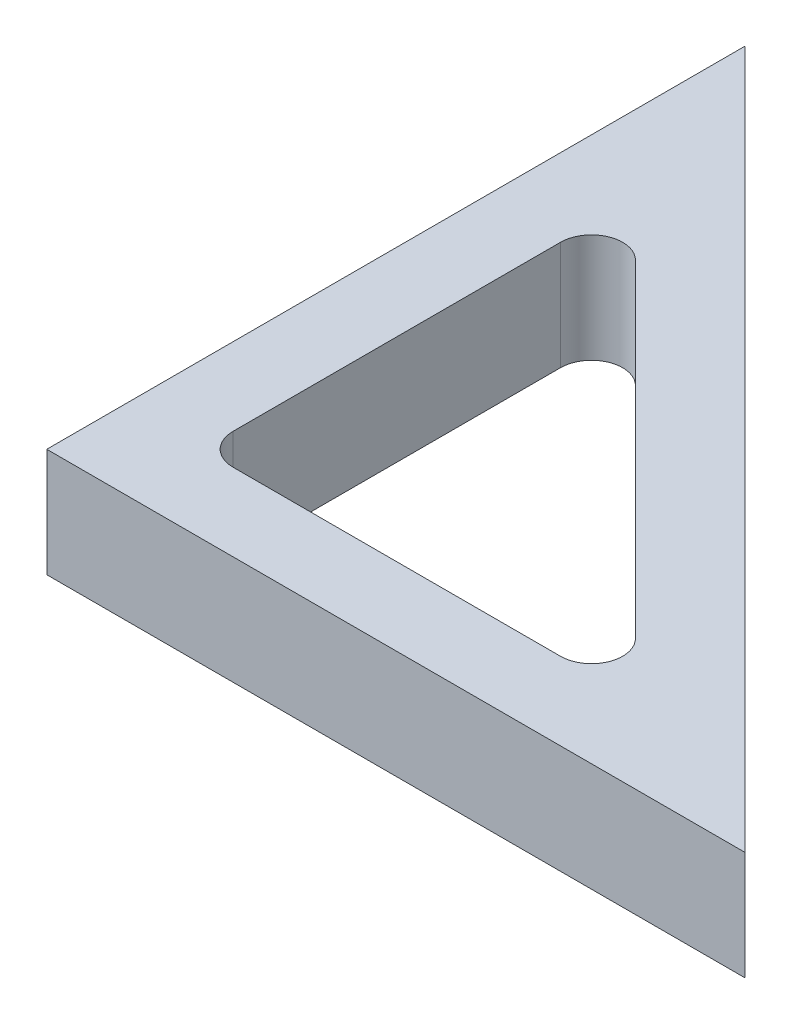
ISO-10303-21;
HEADER;
FILE_DESCRIPTION(('STEP AP214'),'2;1');
FILE_NAME('part.step','',(''),(''),'','','');
FILE_SCHEMA(('AUTOMOTIVE_DESIGN { 1 0 10303 214 1 1 1 1 }'));
ENDSEC;
DATA;
#1=APPLICATION_CONTEXT('core data for automotive mechanical design processes');
#2=APPLICATION_PROTOCOL_DEFINITION('international standard','automotive_design',2000,#1);
#3=PRODUCT_CONTEXT('',#1,'mechanical');
#4=PRODUCT('Part','Part','',(#3));
#5=PRODUCT_RELATED_PRODUCT_CATEGORY('part','',(#4));
#6=PRODUCT_DEFINITION_FORMATION('','',#4);
#7=PRODUCT_DEFINITION_CONTEXT('part definition',#1,'design');
#8=PRODUCT_DEFINITION('design','',#6,#7);
#9=PRODUCT_DEFINITION_SHAPE('','',#8);
#10=(LENGTH_UNIT() NAMED_UNIT(*) SI_UNIT(.MILLI.,.METRE.));
#11=(NAMED_UNIT(*) PLANE_ANGLE_UNIT() SI_UNIT($,.RADIAN.));
#12=(NAMED_UNIT(*) SI_UNIT($,.STERADIAN.) SOLID_ANGLE_UNIT());
#13=UNCERTAINTY_MEASURE_WITH_UNIT(LENGTH_MEASURE(1.E-05),#10,'distance_accuracy_value','');
#14=(GEOMETRIC_REPRESENTATION_CONTEXT(3) GLOBAL_UNCERTAINTY_ASSIGNED_CONTEXT((#13)) GLOBAL_UNIT_ASSIGNED_CONTEXT((#10,
#11,#12)) REPRESENTATION_CONTEXT('',''));
#15=CARTESIAN_POINT('',(0.,0.,0.));
#16=DIRECTION('',(0.,0.,1.));
#17=DIRECTION('',(1.,0.,0.));
#18=AXIS2_PLACEMENT_3D('',#15,#16,#17);
#19=CARTESIAN_POINT('',(0.,7.,0.));
#20=DIRECTION('',(0.,1.,0.));
#21=DIRECTION('',(0.,0.,1.));
#22=AXIS2_PLACEMENT_3D('',#19,#20,#21);
#23=PLANE('',#22);
#24=DIRECTION('',(1.,0.,0.));
#25=VECTOR('',#24,1.);
#26=CARTESIAN_POINT('',(0.,7.,0.));
#27=LINE('',#26,#25);
#28=CARTESIAN_POINT('',(0.,7.,0.));
#29=VERTEX_POINT('',#28);
#30=CARTESIAN_POINT('',(45.,7.,0.));
#31=VERTEX_POINT('',#30);
#32=EDGE_CURVE('E161',#29,#31,#27,.T.);
#33=ORIENTED_EDGE('',*,*,#32,.T.);
#34=DIRECTION('',(-0.707106781186548,0.,-0.707106781186548));
#35=VECTOR('',#34,1.);
#36=CARTESIAN_POINT('',(0.,7.,-45.));
#37=LINE('',#36,#35);
#38=CARTESIAN_POINT('',(0.,7.,-45.));
#39=VERTEX_POINT('',#38);
#40=EDGE_CURVE('E163',#31,#39,#37,.T.);
#41=ORIENTED_EDGE('',*,*,#40,.T.);
#42=DIRECTION('',(0.,0.,1.));
#43=VECTOR('',#42,1.);
#44=CARTESIAN_POINT('',(0.,7.,0.));
#45=LINE('',#44,#43);
#46=EDGE_CURVE('E167',#39,#29,#45,.T.);
#47=ORIENTED_EDGE('',*,*,#46,.T.);
#48=EDGE_LOOP('',(#33,#41,#47));
#49=FACE_BOUND('',#48,.T.);
#50=DIRECTION('',(-0.707106781186548,0.,-0.707106781186547));
#51=VECTOR('',#50,1.);
#52=CARTESIAN_POINT('',(8.41421356237313,7.,-29.5147186257614));
#53=LINE('',#52,#51);
#54=CARTESIAN_POINT('',(29.5147186257614,7.,-8.41421356237313));
#55=VERTEX_POINT('',#54);
#56=CARTESIAN_POINT('',(8.41421356237313,7.,-29.5147186257614));
#57=VERTEX_POINT('',#56);
#58=EDGE_CURVE('E119',#55,#57,#53,.T.);
#59=ORIENTED_EDGE('',*,*,#58,.F.);
#60=CARTESIAN_POINT('',(28.1005050633883,7.,-7.));
#61=DIRECTION('',(0.,1.,0.));
#62=DIRECTION('',(0.,0.,-1.));
#63=AXIS2_PLACEMENT_3D('',#60,#61,#62);
#64=CIRCLE('',#63,2.);
#65=CARTESIAN_POINT('',(28.1005050633883,7.,-5.));
#66=VERTEX_POINT('',#65);
#67=EDGE_CURVE('E110',#66,#55,#64,.T.);
#68=ORIENTED_EDGE('',*,*,#67,.F.);
#69=DIRECTION('',(1.,0.,0.));
#70=VECTOR('',#69,1.);
#71=CARTESIAN_POINT('',(7.00000000000002,7.,-5.));
#72=LINE('',#71,#70);
#73=CARTESIAN_POINT('',(7.,7.,-5.));
#74=VERTEX_POINT('',#73);
#75=EDGE_CURVE('E137',#74,#66,#72,.T.);
#76=ORIENTED_EDGE('',*,*,#75,.F.);
#77=CARTESIAN_POINT('',(7.,7.,-7.));
#78=DIRECTION('',(0.,1.,0.));
#79=DIRECTION('',(0.,0.,1.));
#80=AXIS2_PLACEMENT_3D('',#77,#78,#79);
#81=CIRCLE('',#80,2.);
#82=CARTESIAN_POINT('',(5.,7.,-7.00000000000002));
#83=VERTEX_POINT('',#82);
#84=EDGE_CURVE('E140',#83,#74,#81,.T.);
#85=ORIENTED_EDGE('',*,*,#84,.F.);
#86=DIRECTION('',(0.,0.,1.));
#87=VECTOR('',#86,1.);
#88=CARTESIAN_POINT('',(5.,7.,-7.00000000000002));
#89=LINE('',#88,#87);
#90=CARTESIAN_POINT('',(5.,7.,-28.1005050633883));
#91=VERTEX_POINT('',#90);
#92=EDGE_CURVE('E133',#91,#83,#89,.T.);
#93=ORIENTED_EDGE('',*,*,#92,.F.);
#94=CARTESIAN_POINT('',(7.,7.,-28.1005050633883));
#95=DIRECTION('',(0.,1.,0.));
#96=DIRECTION('',(0.,0.,1.));
#97=AXIS2_PLACEMENT_3D('',#94,#95,#96);
#98=CIRCLE('',#97,2.);
#99=EDGE_CURVE('E131',#57,#91,#98,.T.);
#100=ORIENTED_EDGE('',*,*,#99,.F.);
#101=EDGE_LOOP('',(#59,#68,#76,#85,#93,#100));
#102=FACE_BOUND('',#101,.T.);
#103=ADVANCED_FACE('F39',(#49,#102),#23,.T.);
#104=CARTESIAN_POINT('',(0.,0.,0.));
#105=DIRECTION('',(0.,1.,0.));
#106=DIRECTION('',(0.,0.,1.));
#107=AXIS2_PLACEMENT_3D('',#104,#105,#106);
#108=PLANE('',#107);
#109=DIRECTION('',(1.,0.,0.));
#110=VECTOR('',#109,1.);
#111=CARTESIAN_POINT('',(0.,0.,0.));
#112=LINE('',#111,#110);
#113=CARTESIAN_POINT('',(0.,0.,0.));
#114=VERTEX_POINT('',#113);
#115=CARTESIAN_POINT('',(45.,0.,0.));
#116=VERTEX_POINT('',#115);
#117=EDGE_CURVE('E128',#114,#116,#112,.T.);
#118=ORIENTED_EDGE('',*,*,#117,.F.);
#119=DIRECTION('',(0.,0.,1.));
#120=VECTOR('',#119,1.);
#121=CARTESIAN_POINT('',(0.,0.,0.));
#122=LINE('',#121,#120);
#123=CARTESIAN_POINT('',(0.,0.,-45.));
#124=VERTEX_POINT('',#123);
#125=EDGE_CURVE('E165',#124,#114,#122,.T.);
#126=ORIENTED_EDGE('',*,*,#125,.F.);
#127=DIRECTION('',(-0.707106781186548,0.,-0.707106781186548));
#128=VECTOR('',#127,1.);
#129=CARTESIAN_POINT('',(0.,0.,-45.));
#130=LINE('',#129,#128);
#131=EDGE_CURVE('E175',#116,#124,#130,.T.);
#132=ORIENTED_EDGE('',*,*,#131,.F.);
#133=EDGE_LOOP('',(#118,#126,#132));
#134=FACE_BOUND('',#133,.T.);
#135=CARTESIAN_POINT('',(28.1005050633883,0.,-7.));
#136=DIRECTION('',(0.,1.,0.));
#137=DIRECTION('',(0.,0.,-1.));
#138=AXIS2_PLACEMENT_3D('',#135,#136,#137);
#139=CIRCLE('',#138,2.);
#140=CARTESIAN_POINT('',(28.1005050633883,0.,-5.));
#141=VERTEX_POINT('',#140);
#142=CARTESIAN_POINT('',(29.5147186257614,0.,-8.41421356237313));
#143=VERTEX_POINT('',#142);
#144=EDGE_CURVE('E62',#141,#143,#139,.T.);
#145=ORIENTED_EDGE('',*,*,#144,.T.);
#146=DIRECTION('',(-0.707106781186548,0.,-0.707106781186547));
#147=VECTOR('',#146,1.);
#148=CARTESIAN_POINT('',(8.41421356237313,0.,-29.5147186257614));
#149=LINE('',#148,#147);
#150=CARTESIAN_POINT('',(8.41421356237313,0.,-29.5147186257614));
#151=VERTEX_POINT('',#150);
#152=EDGE_CURVE('E124',#143,#151,#149,.T.);
#153=ORIENTED_EDGE('',*,*,#152,.T.);
#154=CARTESIAN_POINT('',(7.,0.,-28.1005050633883));
#155=DIRECTION('',(0.,1.,0.));
#156=DIRECTION('',(0.,0.,1.));
#157=AXIS2_PLACEMENT_3D('',#154,#155,#156);
#158=CIRCLE('',#157,2.);
#159=CARTESIAN_POINT('',(5.,0.,-28.1005050633883));
#160=VERTEX_POINT('',#159);
#161=EDGE_CURVE('E142',#151,#160,#158,.T.);
#162=ORIENTED_EDGE('',*,*,#161,.T.);
#163=DIRECTION('',(0.,0.,1.));
#164=VECTOR('',#163,1.);
#165=CARTESIAN_POINT('',(5.,0.,-7.00000000000002));
#166=LINE('',#165,#164);
#167=CARTESIAN_POINT('',(5.,0.,-7.00000000000002));
#168=VERTEX_POINT('',#167);
#169=EDGE_CURVE('E147',#160,#168,#166,.T.);
#170=ORIENTED_EDGE('',*,*,#169,.T.);
#171=CARTESIAN_POINT('',(7.,0.,-7.));
#172=DIRECTION('',(0.,1.,0.));
#173=DIRECTION('',(0.,0.,1.));
#174=AXIS2_PLACEMENT_3D('',#171,#172,#173);
#175=CIRCLE('',#174,2.);
#176=CARTESIAN_POINT('',(7.,0.,-5.));
#177=VERTEX_POINT('',#176);
#178=EDGE_CURVE('E146',#168,#177,#175,.T.);
#179=ORIENTED_EDGE('',*,*,#178,.T.);
#180=DIRECTION('',(1.,0.,0.));
#181=VECTOR('',#180,1.);
#182=CARTESIAN_POINT('',(7.00000000000002,0.,-5.));
#183=LINE('',#182,#181);
#184=EDGE_CURVE('E118',#177,#141,#183,.T.);
#185=ORIENTED_EDGE('',*,*,#184,.T.);
#186=EDGE_LOOP('',(#145,#153,#162,#170,#179,#185));
#187=FACE_BOUND('',#186,.T.);
#188=ADVANCED_FACE('F186',(#134,#187),#108,.F.);
#189=CARTESIAN_POINT('',(0.,7.,0.));
#190=DIRECTION('',(0.,0.,-1.));
#191=DIRECTION('',(-1.,0.,0.));
#192=AXIS2_PLACEMENT_3D('',#189,#190,#191);
#193=PLANE('',#192);
#194=ORIENTED_EDGE('',*,*,#117,.T.);
#195=DIRECTION('',(0.,-1.,0.));
#196=VECTOR('',#195,1.);
#197=CARTESIAN_POINT('',(45.,7.,0.));
#198=LINE('',#197,#196);
#199=EDGE_CURVE('E11',#31,#116,#198,.T.);
#200=ORIENTED_EDGE('',*,*,#199,.F.);
#201=ORIENTED_EDGE('',*,*,#32,.F.);
#202=DIRECTION('',(0.,-1.,0.));
#203=VECTOR('',#202,1.);
#204=CARTESIAN_POINT('',(0.,7.,0.));
#205=LINE('',#204,#203);
#206=EDGE_CURVE('E170',#29,#114,#205,.T.);
#207=ORIENTED_EDGE('',*,*,#206,.T.);
#208=EDGE_LOOP('',(#194,#200,#201,#207));
#209=FACE_BOUND('',#208,.T.);
#210=ADVANCED_FACE('F41',(#209),#193,.F.);
#211=CARTESIAN_POINT('',(0.,7.,-45.));
#212=DIRECTION('',(-0.707106781186547,0.,0.707106781186547));
#213=DIRECTION('',(0.707106781186548,0.,0.707106781186548));
#214=AXIS2_PLACEMENT_3D('',#211,#212,#213);
#215=PLANE('',#214);
#216=ORIENTED_EDGE('',*,*,#131,.T.);
#217=DIRECTION('',(0.,-1.,0.));
#218=VECTOR('',#217,1.);
#219=CARTESIAN_POINT('',(0.,7.,-45.));
#220=LINE('',#219,#218);
#221=EDGE_CURVE('E50',#39,#124,#220,.T.);
#222=ORIENTED_EDGE('',*,*,#221,.F.);
#223=ORIENTED_EDGE('',*,*,#40,.F.);
#224=ORIENTED_EDGE('',*,*,#199,.T.);
#225=EDGE_LOOP('',(#216,#222,#223,#224));
#226=FACE_BOUND('',#225,.T.);
#227=ADVANCED_FACE('F195',(#226),#215,.F.);
#228=CARTESIAN_POINT('',(0.,7.,0.));
#229=DIRECTION('',(1.,0.,0.));
#230=DIRECTION('',(0.,0.,-1.));
#231=AXIS2_PLACEMENT_3D('',#228,#229,#230);
#232=PLANE('',#231);
#233=ORIENTED_EDGE('',*,*,#125,.T.);
#234=ORIENTED_EDGE('',*,*,#206,.F.);
#235=ORIENTED_EDGE('',*,*,#46,.F.);
#236=ORIENTED_EDGE('',*,*,#221,.T.);
#237=EDGE_LOOP('',(#233,#234,#235,#236));
#238=FACE_BOUND('',#237,.T.);
#239=ADVANCED_FACE('F181',(#238),#232,.F.);
#240=CARTESIAN_POINT('',(28.1005050633883,7.,-7.));
#241=DIRECTION('',(0.,-1.,0.));
#242=DIRECTION('',(0.,0.,-1.));
#243=AXIS2_PLACEMENT_3D('',#240,#241,#242);
#244=CYLINDRICAL_SURFACE('',#243,2.);
#245=ORIENTED_EDGE('',*,*,#144,.F.);
#246=DIRECTION('',(0.,-1.,0.));
#247=VECTOR('',#246,1.);
#248=CARTESIAN_POINT('',(28.1005050633883,7.,-5.));
#249=LINE('',#248,#247);
#250=EDGE_CURVE('E114',#66,#141,#249,.T.);
#251=ORIENTED_EDGE('',*,*,#250,.F.);
#252=ORIENTED_EDGE('',*,*,#67,.T.);
#253=DIRECTION('',(0.,-1.,0.));
#254=VECTOR('',#253,1.);
#255=CARTESIAN_POINT('',(29.5147186257614,7.,-8.41421356237313));
#256=LINE('',#255,#254);
#257=EDGE_CURVE('E111',#55,#143,#256,.T.);
#258=ORIENTED_EDGE('',*,*,#257,.T.);
#259=EDGE_LOOP('',(#245,#251,#252,#258));
#260=FACE_BOUND('',#259,.T.);
#261=ADVANCED_FACE('F115',(#260),#244,.F.);
#262=CARTESIAN_POINT('',(8.41421356237313,7.,-29.5147186257614));
#263=DIRECTION('',(-0.707106781186547,0.,0.707106781186548));
#264=DIRECTION('',(0.707106781186548,0.,0.707106781186547));
#265=AXIS2_PLACEMENT_3D('',#262,#263,#264);
#266=PLANE('',#265);
#267=ORIENTED_EDGE('',*,*,#152,.F.);
#268=ORIENTED_EDGE('',*,*,#257,.F.);
#269=ORIENTED_EDGE('',*,*,#58,.T.);
#270=DIRECTION('',(0.,-1.,0.));
#271=VECTOR('',#270,1.);
#272=CARTESIAN_POINT('',(8.41421356237313,7.,-29.5147186257614));
#273=LINE('',#272,#271);
#274=EDGE_CURVE('E130',#57,#151,#273,.T.);
#275=ORIENTED_EDGE('',*,*,#274,.T.);
#276=EDGE_LOOP('',(#267,#268,#269,#275));
#277=FACE_BOUND('',#276,.T.);
#278=ADVANCED_FACE('F122',(#277),#266,.T.);
#279=CARTESIAN_POINT('',(7.,7.,-28.1005050633883));
#280=DIRECTION('',(0.,-1.,0.));
#281=DIRECTION('',(0.,0.,-1.));
#282=AXIS2_PLACEMENT_3D('',#279,#280,#281);
#283=CYLINDRICAL_SURFACE('',#282,2.);
#284=ORIENTED_EDGE('',*,*,#161,.F.);
#285=ORIENTED_EDGE('',*,*,#274,.F.);
#286=ORIENTED_EDGE('',*,*,#99,.T.);
#287=DIRECTION('',(0.,-1.,0.));
#288=VECTOR('',#287,1.);
#289=CARTESIAN_POINT('',(5.,7.,-28.1005050633883));
#290=LINE('',#289,#288);
#291=EDGE_CURVE('E156',#91,#160,#290,.T.);
#292=ORIENTED_EDGE('',*,*,#291,.T.);
#293=EDGE_LOOP('',(#284,#285,#286,#292));
#294=FACE_BOUND('',#293,.T.);
#295=ADVANCED_FACE('F210',(#294),#283,.F.);
#296=CARTESIAN_POINT('',(5.,7.,-7.00000000000002));
#297=DIRECTION('',(1.,0.,0.));
#298=DIRECTION('',(0.,0.,-1.));
#299=AXIS2_PLACEMENT_3D('',#296,#297,#298);
#300=PLANE('',#299);
#301=ORIENTED_EDGE('',*,*,#169,.F.);
#302=ORIENTED_EDGE('',*,*,#291,.F.);
#303=ORIENTED_EDGE('',*,*,#92,.T.);
#304=DIRECTION('',(0.,-1.,0.));
#305=VECTOR('',#304,1.);
#306=CARTESIAN_POINT('',(5.,7.,-7.00000000000002));
#307=LINE('',#306,#305);
#308=EDGE_CURVE('E157',#83,#168,#307,.T.);
#309=ORIENTED_EDGE('',*,*,#308,.T.);
#310=EDGE_LOOP('',(#301,#302,#303,#309));
#311=FACE_BOUND('',#310,.T.);
#312=ADVANCED_FACE('F211',(#311),#300,.T.);
#313=CARTESIAN_POINT('',(7.,7.,-7.));
#314=DIRECTION('',(0.,-1.,0.));
#315=DIRECTION('',(0.,0.,-1.));
#316=AXIS2_PLACEMENT_3D('',#313,#314,#315);
#317=CYLINDRICAL_SURFACE('',#316,2.);
#318=ORIENTED_EDGE('',*,*,#178,.F.);
#319=ORIENTED_EDGE('',*,*,#308,.F.);
#320=ORIENTED_EDGE('',*,*,#84,.T.);
#321=DIRECTION('',(0.,-1.,0.));
#322=VECTOR('',#321,1.);
#323=CARTESIAN_POINT('',(7.,7.,-5.));
#324=LINE('',#323,#322);
#325=EDGE_CURVE('E53',#74,#177,#324,.T.);
#326=ORIENTED_EDGE('',*,*,#325,.T.);
#327=EDGE_LOOP('',(#318,#319,#320,#326));
#328=FACE_BOUND('',#327,.T.);
#329=ADVANCED_FACE('F220',(#328),#317,.F.);
#330=CARTESIAN_POINT('',(7.00000000000002,7.,-5.));
#331=DIRECTION('',(0.,0.,-1.));
#332=DIRECTION('',(-1.,0.,0.));
#333=AXIS2_PLACEMENT_3D('',#330,#331,#332);
#334=PLANE('',#333);
#335=ORIENTED_EDGE('',*,*,#184,.F.);
#336=ORIENTED_EDGE('',*,*,#325,.F.);
#337=ORIENTED_EDGE('',*,*,#75,.T.);
#338=ORIENTED_EDGE('',*,*,#250,.T.);
#339=EDGE_LOOP('',(#335,#336,#337,#338));
#340=FACE_BOUND('',#339,.T.);
#341=ADVANCED_FACE('F221',(#340),#334,.T.);
#342=CLOSED_SHELL('',(#103,#188,#210,#227,#239,#261,#278,#295,#312,#329,#341));
#343=MANIFOLD_SOLID_BREP('B2',#342);
#344=ADVANCED_BREP_SHAPE_REPRESENTATION('',(#18,#343),#14);
#345=SHAPE_DEFINITION_REPRESENTATION(#9,#344);
ENDSEC;
END-ISO-10303-21;
